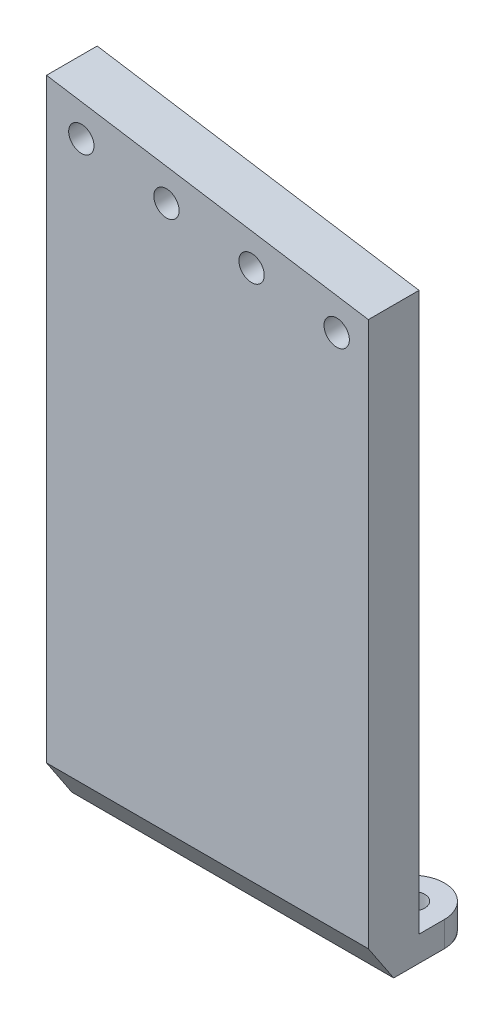
ISO-10303-21;
HEADER;
FILE_DESCRIPTION(('STEP AP214'),'2;1');
FILE_NAME('part.step','',(''),(''),'','','');
FILE_SCHEMA(('AUTOMOTIVE_DESIGN { 1 0 10303 214 1 1 1 1 }'));
ENDSEC;
DATA;
#1=APPLICATION_CONTEXT('core data for automotive mechanical design processes');
#2=APPLICATION_PROTOCOL_DEFINITION('international standard','automotive_design',2000,#1);
#3=PRODUCT_CONTEXT('',#1,'mechanical');
#4=PRODUCT('Part','Part','',(#3));
#5=PRODUCT_RELATED_PRODUCT_CATEGORY('part','',(#4));
#6=PRODUCT_DEFINITION_FORMATION('','',#4);
#7=PRODUCT_DEFINITION_CONTEXT('part definition',#1,'design');
#8=PRODUCT_DEFINITION('design','',#6,#7);
#9=PRODUCT_DEFINITION_SHAPE('','',#8);
#10=(LENGTH_UNIT() NAMED_UNIT(*) SI_UNIT(.MILLI.,.METRE.));
#11=(NAMED_UNIT(*) PLANE_ANGLE_UNIT() SI_UNIT($,.RADIAN.));
#12=(NAMED_UNIT(*) SI_UNIT($,.STERADIAN.) SOLID_ANGLE_UNIT());
#13=UNCERTAINTY_MEASURE_WITH_UNIT(LENGTH_MEASURE(1.E-05),#10,'distance_accuracy_value','');
#14=(GEOMETRIC_REPRESENTATION_CONTEXT(3) GLOBAL_UNCERTAINTY_ASSIGNED_CONTEXT((#13)) GLOBAL_UNIT_ASSIGNED_CONTEXT((#10,
#11,#12)) REPRESENTATION_CONTEXT('',''));
#15=CARTESIAN_POINT('',(0.,0.,0.));
#16=DIRECTION('',(0.,0.,1.));
#17=DIRECTION('',(1.,0.,0.));
#18=AXIS2_PLACEMENT_3D('',#15,#16,#17);
#19=CARTESIAN_POINT('',(3.175,2.54,-7.62));
#20=DIRECTION('',(0.,-1.,0.));
#21=DIRECTION('',(0.,0.,-1.));
#22=AXIS2_PLACEMENT_3D('',#19,#20,#21);
#23=PLANE('',#22);
#24=CARTESIAN_POINT('',(35.433,2.54,-7.62));
#25=DIRECTION('',(0.,-1.,0.));
#26=DIRECTION('',(0.,0.,1.));
#27=AXIS2_PLACEMENT_3D('',#24,#25,#26);
#28=CIRCLE('',#27,3.175);
#29=CARTESIAN_POINT('',(32.258,2.54,-7.62));
#30=VERTEX_POINT('',#29);
#31=CARTESIAN_POINT('',(38.608,2.54,-7.62));
#32=VERTEX_POINT('',#31);
#33=EDGE_CURVE('E185',#30,#32,#28,.T.);
#34=ORIENTED_EDGE('',*,*,#33,.F.);
#35=DIRECTION('',(0.,0.,1.));
#36=VECTOR('',#35,1.);
#37=CARTESIAN_POINT('',(32.258,2.54,-7.62));
#38=LINE('',#37,#36);
#39=CARTESIAN_POINT('',(32.258,2.54,-5.08));
#40=VERTEX_POINT('',#39);
#41=EDGE_CURVE('E152',#30,#40,#38,.T.);
#42=ORIENTED_EDGE('',*,*,#41,.T.);
#43=DIRECTION('',(-1.,0.,0.));
#44=VECTOR('',#43,1.);
#45=CARTESIAN_POINT('',(0.,2.54,-5.08));
#46=LINE('',#45,#44);
#47=CARTESIAN_POINT('',(64.516,2.54,-5.08));
#48=VERTEX_POINT('',#47);
#49=EDGE_CURVE('E11',#48,#40,#46,.T.);
#50=ORIENTED_EDGE('',*,*,#49,.F.);
#51=DIRECTION('',(0.,0.,1.));
#52=VECTOR('',#51,1.);
#53=CARTESIAN_POINT('',(64.516,2.54,0.));
#54=LINE('',#53,#52);
#55=CARTESIAN_POINT('',(64.516,2.54,-7.62));
#56=VERTEX_POINT('',#55);
#57=EDGE_CURVE('E188',#56,#48,#54,.T.);
#58=ORIENTED_EDGE('',*,*,#57,.F.);
#59=CARTESIAN_POINT('',(61.341,2.54,-7.62));
#60=DIRECTION('',(0.,-1.,0.));
#61=DIRECTION('',(0.,0.,-1.));
#62=AXIS2_PLACEMENT_3D('',#59,#60,#61);
#63=CIRCLE('',#62,3.175);
#64=CARTESIAN_POINT('',(58.166,2.54,-7.62));
#65=VERTEX_POINT('',#64);
#66=EDGE_CURVE('E372',#65,#56,#63,.T.);
#67=ORIENTED_EDGE('',*,*,#66,.F.);
#68=DIRECTION('',(1.,0.,0.));
#69=VECTOR('',#68,1.);
#70=CARTESIAN_POINT('',(58.166,2.54,-7.62));
#71=LINE('',#70,#69);
#72=EDGE_CURVE('E374',#32,#65,#71,.T.);
#73=ORIENTED_EDGE('',*,*,#72,.F.);
#74=EDGE_LOOP('',(#34,#42,#50,#58,#67,#73));
#75=FACE_BOUND('',#74,.T.);
#76=CARTESIAN_POINT('',(35.433,2.54,-7.62));
#77=DIRECTION('',(0.,-1.,0.));
#78=DIRECTION('',(0.,0.,1.));
#79=AXIS2_PLACEMENT_3D('',#76,#77,#78);
#80=CIRCLE('',#79,1.2065);
#81=CARTESIAN_POINT('',(35.433,2.54,-6.4135));
#82=VERTEX_POINT('',#81);
#83=EDGE_CURVE('E176',#82,#82,#80,.T.);
#84=ORIENTED_EDGE('',*,*,#83,.T.);
#85=EDGE_LOOP('',(#84));
#86=FACE_BOUND('',#85,.T.);
#87=CARTESIAN_POINT('',(61.341,2.54,-7.62));
#88=DIRECTION('',(0.,-1.,0.));
#89=DIRECTION('',(0.,0.,1.));
#90=AXIS2_PLACEMENT_3D('',#87,#88,#89);
#91=CIRCLE('',#90,1.2065);
#92=CARTESIAN_POINT('',(61.341,2.54,-6.4135));
#93=VERTEX_POINT('',#92);
#94=EDGE_CURVE('E179',#93,#93,#91,.T.);
#95=ORIENTED_EDGE('',*,*,#94,.T.);
#96=EDGE_LOOP('',(#95));
#97=FACE_BOUND('',#96,.T.);
#98=ADVANCED_FACE('F33',(#75,#86,#97),#23,.F.);
#99=CARTESIAN_POINT('',(3.175,0.,-7.62));
#100=DIRECTION('',(0.,-1.,0.));
#101=DIRECTION('',(0.,0.,-1.));
#102=AXIS2_PLACEMENT_3D('',#99,#100,#101);
#103=PLANE('',#102);
#104=DIRECTION('',(0.,0.,1.));
#105=VECTOR('',#104,1.);
#106=CARTESIAN_POINT('',(32.258,0.,-7.62));
#107=LINE('',#106,#105);
#108=CARTESIAN_POINT('',(32.258,0.,-6.6275294111197));
#109=VERTEX_POINT('',#108);
#110=CARTESIAN_POINT('',(32.258,0.,-2.54));
#111=VERTEX_POINT('',#110);
#112=EDGE_CURVE('E255',#109,#111,#107,.T.);
#113=ORIENTED_EDGE('',*,*,#112,.F.);
#114=CARTESIAN_POINT('',(35.3490541248744,0.,-7.64786729186757));
#115=DIRECTION('',(0.,1.,0.));
#116=DIRECTION('',(1.,0.,0.));
#117=AXIS2_PLACEMENT_3D('',#114,#115,#116);
#118=ELLIPSE('',#117,3.25906797448663,3.21939192033137);
#119=CARTESIAN_POINT('',(38.608,0.,-7.62));
#120=VERTEX_POINT('',#119);
#121=EDGE_CURVE('E257',#109,#120,#118,.T.);
#122=ORIENTED_EDGE('',*,*,#121,.T.);
#123=DIRECTION('',(1.,0.,0.));
#124=VECTOR('',#123,1.);
#125=CARTESIAN_POINT('',(58.166,0.,-7.62));
#126=LINE('',#125,#124);
#127=CARTESIAN_POINT('',(58.0046427910713,0.,-7.62));
#128=VERTEX_POINT('',#127);
#129=EDGE_CURVE('E362',#120,#128,#126,.T.);
#130=ORIENTED_EDGE('',*,*,#129,.T.);
#131=CARTESIAN_POINT('',(61.2603213955356,0.,-7.61591866559716));
#132=DIRECTION('',(0.,1.,0.));
#133=DIRECTION('',(1.,0.,0.));
#134=AXIS2_PLACEMENT_3D('',#131,#132,#133);
#135=ELLIPSE('',#134,3.25568122609679,3.21604640238336);
#136=CARTESIAN_POINT('',(64.516,0.,-7.61183733119424));
#137=VERTEX_POINT('',#136);
#138=EDGE_CURVE('E339',#128,#137,#135,.T.);
#139=ORIENTED_EDGE('',*,*,#138,.T.);
#140=DIRECTION('',(0.,0.,1.));
#141=VECTOR('',#140,1.);
#142=CARTESIAN_POINT('',(64.516,0.,0.));
#143=LINE('',#142,#141);
#144=CARTESIAN_POINT('',(64.516,0.,-2.54));
#145=VERTEX_POINT('',#144);
#146=EDGE_CURVE('E182',#137,#145,#143,.T.);
#147=ORIENTED_EDGE('',*,*,#146,.T.);
#148=DIRECTION('',(-1.,0.,0.));
#149=VECTOR('',#148,1.);
#150=CARTESIAN_POINT('',(36.8370501198393,0.,-2.54));
#151=LINE('',#150,#149);
#152=EDGE_CURVE('E41',#145,#111,#151,.T.);
#153=ORIENTED_EDGE('',*,*,#152,.T.);
#154=EDGE_LOOP('',(#113,#122,#130,#139,#147,#153));
#155=FACE_BOUND('',#154,.T.);
#156=ADVANCED_FACE('F246',(#155),#103,.T.);
#157=CARTESIAN_POINT('',(0.,2.54,0.));
#158=DIRECTION('',(0.,0.,-1.));
#159=DIRECTION('',(-1.,0.,0.));
#160=AXIS2_PLACEMENT_3D('',#157,#158,#159);
#161=PLANE('',#160);
#162=DIRECTION('',(-0.987825950711718,0.155563141844365,0.));
#163=VECTOR('',#162,1.);
#164=CARTESIAN_POINT('',(32.258,63.5,0.));
#165=LINE('',#164,#163);
#166=CARTESIAN_POINT('',(64.516,58.42,0.));
#167=VERTEX_POINT('',#166);
#168=CARTESIAN_POINT('',(32.258,63.5,0.));
#169=VERTEX_POINT('',#168);
#170=EDGE_CURVE('E158',#167,#169,#165,.T.);
#171=ORIENTED_EDGE('',*,*,#170,.T.);
#172=DIRECTION('',(0.,-1.,0.));
#173=VECTOR('',#172,1.);
#174=CARTESIAN_POINT('',(32.258,63.5,0.));
#175=LINE('',#174,#173);
#176=CARTESIAN_POINT('',(32.258,3.81,0.));
#177=VERTEX_POINT('',#176);
#178=EDGE_CURVE('E142',#169,#177,#175,.T.);
#179=ORIENTED_EDGE('',*,*,#178,.T.);
#180=DIRECTION('',(-1.,0.,0.));
#181=VECTOR('',#180,1.);
#182=CARTESIAN_POINT('',(36.8370501198393,3.81,0.));
#183=LINE('',#182,#181);
#184=CARTESIAN_POINT('',(64.516,3.81,0.));
#185=VERTEX_POINT('',#184);
#186=EDGE_CURVE('E211',#185,#177,#183,.T.);
#187=ORIENTED_EDGE('',*,*,#186,.F.);
#188=DIRECTION('',(0.,-1.,0.));
#189=VECTOR('',#188,1.);
#190=CARTESIAN_POINT('',(64.516,2.54,0.));
#191=LINE('',#190,#189);
#192=EDGE_CURVE('E165',#167,#185,#191,.T.);
#193=ORIENTED_EDGE('',*,*,#192,.F.);
#194=EDGE_LOOP('',(#171,#179,#187,#193));
#195=FACE_BOUND('',#194,.T.);
#196=CARTESIAN_POINT('',(61.341,55.7058710355681,0.));
#197=DIRECTION('',(0.,0.,1.));
#198=DIRECTION('',(1.,0.,0.));
#199=AXIS2_PLACEMENT_3D('',#196,#197,#198);
#200=CIRCLE('',#199,1.27);
#201=CARTESIAN_POINT('',(62.611,55.7058710355681,0.));
#202=VERTEX_POINT('',#201);
#203=EDGE_CURVE('E273',#202,#202,#200,.F.);
#204=ORIENTED_EDGE('',*,*,#203,.T.);
#205=EDGE_LOOP('',(#204));
#206=FACE_BOUND('',#205,.T.);
#207=CARTESIAN_POINT('',(52.8101350896536,57.049314328536,0.));
#208=DIRECTION('',(0.,0.,1.));
#209=DIRECTION('',(1.,0.,0.));
#210=AXIS2_PLACEMENT_3D('',#207,#208,#209);
#211=CIRCLE('',#210,1.27);
#212=CARTESIAN_POINT('',(54.0801350896536,57.049314328536,0.));
#213=VERTEX_POINT('',#212);
#214=EDGE_CURVE('E279',#213,#213,#211,.F.);
#215=ORIENTED_EDGE('',*,*,#214,.T.);
#216=EDGE_LOOP('',(#215));
#217=FACE_BOUND('',#216,.T.);
#218=CARTESIAN_POINT('',(44.2792701793072,58.392757621504,0.));
#219=DIRECTION('',(0.,0.,1.));
#220=DIRECTION('',(1.,0.,0.));
#221=AXIS2_PLACEMENT_3D('',#218,#219,#220);
#222=CIRCLE('',#221,1.27);
#223=CARTESIAN_POINT('',(45.5492701793072,58.392757621504,0.));
#224=VERTEX_POINT('',#223);
#225=EDGE_CURVE('E285',#224,#224,#222,.F.);
#226=ORIENTED_EDGE('',*,*,#225,.T.);
#227=EDGE_LOOP('',(#226));
#228=FACE_BOUND('',#227,.T.);
#229=CARTESIAN_POINT('',(35.7484052689608,59.7362009144719,0.));
#230=DIRECTION('',(0.,0.,1.));
#231=DIRECTION('',(1.,0.,0.));
#232=AXIS2_PLACEMENT_3D('',#229,#230,#231);
#233=CIRCLE('',#232,1.27);
#234=CARTESIAN_POINT('',(37.0184052689608,59.7362009144719,0.));
#235=VERTEX_POINT('',#234);
#236=EDGE_CURVE('E168',#235,#235,#233,.F.);
#237=ORIENTED_EDGE('',*,*,#236,.T.);
#238=EDGE_LOOP('',(#237));
#239=FACE_BOUND('',#238,.T.);
#240=ADVANCED_FACE('F35',(#195,#206,#217,#228,#239),#161,.F.);
#241=CARTESIAN_POINT('',(0.,63.5,-5.08));
#242=DIRECTION('',(0.,0.,1.));
#243=DIRECTION('',(1.,0.,0.));
#244=AXIS2_PLACEMENT_3D('',#241,#242,#243);
#245=PLANE('',#244);
#246=ORIENTED_EDGE('',*,*,#49,.T.);
#247=DIRECTION('',(0.,1.,0.));
#248=VECTOR('',#247,1.);
#249=CARTESIAN_POINT('',(32.258,63.5,-5.08));
#250=LINE('',#249,#248);
#251=CARTESIAN_POINT('',(32.258,63.5,-5.08));
#252=VERTEX_POINT('',#251);
#253=EDGE_CURVE('E379',#40,#252,#250,.T.);
#254=ORIENTED_EDGE('',*,*,#253,.T.);
#255=DIRECTION('',(0.987825950711718,-0.155563141844365,0.));
#256=VECTOR('',#255,1.);
#257=CARTESIAN_POINT('',(32.258,63.5,-5.08));
#258=LINE('',#257,#256);
#259=CARTESIAN_POINT('',(64.516,58.42,-5.08));
#260=VERTEX_POINT('',#259);
#261=EDGE_CURVE('E160',#252,#260,#258,.T.);
#262=ORIENTED_EDGE('',*,*,#261,.T.);
#263=DIRECTION('',(0.,-1.,0.));
#264=VECTOR('',#263,1.);
#265=CARTESIAN_POINT('',(64.516,63.5,-5.08));
#266=LINE('',#265,#264);
#267=EDGE_CURVE('E161',#260,#48,#266,.T.);
#268=ORIENTED_EDGE('',*,*,#267,.T.);
#269=EDGE_LOOP('',(#246,#254,#262,#268));
#270=FACE_BOUND('',#269,.T.);
#271=CARTESIAN_POINT('',(61.341,55.7058710355681,-5.08));
#272=DIRECTION('',(0.,0.,1.));
#273=DIRECTION('',(1.,0.,0.));
#274=AXIS2_PLACEMENT_3D('',#271,#272,#273);
#275=CIRCLE('',#274,1.27);
#276=CARTESIAN_POINT('',(62.611,55.7058710355681,-5.08));
#277=VERTEX_POINT('',#276);
#278=EDGE_CURVE('E265',#277,#277,#275,.T.);
#279=ORIENTED_EDGE('',*,*,#278,.T.);
#280=EDGE_LOOP('',(#279));
#281=FACE_BOUND('',#280,.T.);
#282=CARTESIAN_POINT('',(52.8101350896536,57.049314328536,-5.08));
#283=DIRECTION('',(0.,0.,1.));
#284=DIRECTION('',(1.,0.,0.));
#285=AXIS2_PLACEMENT_3D('',#282,#283,#284);
#286=CIRCLE('',#285,1.27);
#287=CARTESIAN_POINT('',(54.0801350896536,57.049314328536,-5.08));
#288=VERTEX_POINT('',#287);
#289=EDGE_CURVE('E276',#288,#288,#286,.T.);
#290=ORIENTED_EDGE('',*,*,#289,.T.);
#291=EDGE_LOOP('',(#290));
#292=FACE_BOUND('',#291,.T.);
#293=CARTESIAN_POINT('',(44.2792701793072,58.392757621504,-5.08));
#294=DIRECTION('',(0.,0.,1.));
#295=DIRECTION('',(1.,0.,0.));
#296=AXIS2_PLACEMENT_3D('',#293,#294,#295);
#297=CIRCLE('',#296,1.27);
#298=CARTESIAN_POINT('',(45.5492701793072,58.392757621504,-5.08));
#299=VERTEX_POINT('',#298);
#300=EDGE_CURVE('E282',#299,#299,#297,.T.);
#301=ORIENTED_EDGE('',*,*,#300,.T.);
#302=EDGE_LOOP('',(#301));
#303=FACE_BOUND('',#302,.T.);
#304=CARTESIAN_POINT('',(35.7484052689608,59.7362009144719,-5.08));
#305=DIRECTION('',(0.,0.,1.));
#306=DIRECTION('',(1.,0.,0.));
#307=AXIS2_PLACEMENT_3D('',#304,#305,#306);
#308=CIRCLE('',#307,1.27);
#309=CARTESIAN_POINT('',(37.0184052689608,59.7362009144719,-5.08));
#310=VERTEX_POINT('',#309);
#311=EDGE_CURVE('E172',#310,#310,#308,.T.);
#312=ORIENTED_EDGE('',*,*,#311,.T.);
#313=EDGE_LOOP('',(#312));
#314=FACE_BOUND('',#313,.T.);
#315=ADVANCED_FACE('F240',(#270,#281,#292,#303,#314),#245,.F.);
#316=CARTESIAN_POINT('',(36.8370501198393,0.,-2.54));
#317=DIRECTION('',(0.,0.554700196225229,-0.832050294337844));
#318=DIRECTION('',(0.,0.832050294337844,0.554700196225229));
#319=AXIS2_PLACEMENT_3D('',#316,#317,#318);
#320=PLANE('',#319);
#321=ORIENTED_EDGE('',*,*,#186,.T.);
#322=DIRECTION('',(0.,-0.832050294337844,-0.554700196225229));
#323=VECTOR('',#322,1.);
#324=CARTESIAN_POINT('',(32.258,0.,-2.54));
#325=LINE('',#324,#323);
#326=EDGE_CURVE('E148',#177,#111,#325,.T.);
#327=ORIENTED_EDGE('',*,*,#326,.T.);
#328=ORIENTED_EDGE('',*,*,#152,.F.);
#329=DIRECTION('',(0.,-0.832050294337844,-0.554700196225229));
#330=VECTOR('',#329,1.);
#331=CARTESIAN_POINT('',(64.516,0.,-2.54));
#332=LINE('',#331,#330);
#333=EDGE_CURVE('E262',#185,#145,#332,.T.);
#334=ORIENTED_EDGE('',*,*,#333,.F.);
#335=EDGE_LOOP('',(#321,#327,#328,#334));
#336=FACE_BOUND('',#335,.T.);
#337=ADVANCED_FACE('F237',(#336),#320,.F.);
#338=CARTESIAN_POINT('',(61.341,0.,-7.62));
#339=DIRECTION('',(0.,-1.,0.));
#340=DIRECTION('',(0.,0.,-1.));
#341=AXIS2_PLACEMENT_3D('',#338,#339,#340);
#342=PLANE('',#341);
#343=CARTESIAN_POINT('',(64.5159999999775,3.54360638055162E-12,-7.62000003545597));
#344=VERTEX_POINT('',#343);
#345=CARTESIAN_POINT('',(63.7576621756475,0.,-9.67921280863444));
#346=VERTEX_POINT('',#345);
#347=EDGE_CURVE('E348',#344,#346,#135,.T.);
#348=ORIENTED_EDGE('',*,*,#347,.T.);
#349=CARTESIAN_POINT('',(61.341,0.,-7.62));
#350=DIRECTION('',(0.,-1.,0.));
#351=DIRECTION('',(0.,0.,-1.));
#352=AXIS2_PLACEMENT_3D('',#349,#350,#351);
#353=CIRCLE('',#352,3.175);
#354=EDGE_CURVE('E363',#346,#344,#353,.T.);
#355=ORIENTED_EDGE('',*,*,#354,.T.);
#356=EDGE_LOOP('',(#348,#355));
#357=FACE_BOUND('',#356,.T.);
#358=ADVANCED_FACE('F225',(#357),#342,.T.);
#359=CARTESIAN_POINT('',(64.516,2.54,0.));
#360=DIRECTION('',(-1.,0.,0.));
#361=DIRECTION('',(0.,0.,-1.));
#362=AXIS2_PLACEMENT_3D('',#359,#360,#361);
#363=PLANE('',#362);
#364=CARTESIAN_POINT('',(64.516,0.,-7.61591866559716));
#365=VERTEX_POINT('',#364);
#366=EDGE_CURVE('E364',#344,#365,#143,.T.);
#367=ORIENTED_EDGE('',*,*,#366,.F.);
#368=DIRECTION('',(0.,-1.,0.));
#369=VECTOR('',#368,1.);
#370=CARTESIAN_POINT('',(64.516,2.54,-7.62));
#371=LINE('',#370,#369);
#372=EDGE_CURVE('E57',#56,#344,#371,.T.);
#373=ORIENTED_EDGE('',*,*,#372,.F.);
#374=ORIENTED_EDGE('',*,*,#57,.T.);
#375=ORIENTED_EDGE('',*,*,#267,.F.);
#376=DIRECTION('',(0.,0.,1.));
#377=VECTOR('',#376,1.);
#378=CARTESIAN_POINT('',(64.516,58.42,-37.735550278628));
#379=LINE('',#378,#377);
#380=EDGE_CURVE('E167',#260,#167,#379,.T.);
#381=ORIENTED_EDGE('',*,*,#380,.T.);
#382=ORIENTED_EDGE('',*,*,#192,.T.);
#383=ORIENTED_EDGE('',*,*,#333,.T.);
#384=ORIENTED_EDGE('',*,*,#146,.F.);
#385=CARTESIAN_POINT('',(61.3391084632219,0.500297879807579,-7.61591866559716));
#386=DIRECTION('',(-0.155563141844365,-0.987825950711718,0.));
#387=DIRECTION('',(0.987825950711718,-0.155563141844365,0.));
#388=AXIS2_PLACEMENT_3D('',#385,#386,#387);
#389=CIRCLE('',#388,3.21604640238336);
#390=EDGE_CURVE('E204',#365,#137,#389,.T.);
#391=ORIENTED_EDGE('',*,*,#390,.F.);
#392=EDGE_LOOP('',(#367,#373,#374,#375,#381,#382,#383,#384,#391));
#393=FACE_BOUND('',#392,.T.);
#394=ADVANCED_FACE('F233',(#393),#363,.F.);
#395=CARTESIAN_POINT('',(35.433,2.54,-7.62));
#396=DIRECTION('',(0.,-1.,0.));
#397=DIRECTION('',(0.,0.,-1.));
#398=AXIS2_PLACEMENT_3D('',#395,#396,#397);
#399=CYLINDRICAL_SURFACE('',#398,3.175);
#400=DIRECTION('',(0.,-1.,0.));
#401=VECTOR('',#400,1.);
#402=CARTESIAN_POINT('',(32.258,2.54,-7.62));
#403=LINE('',#402,#401);
#404=CARTESIAN_POINT('',(32.258,0.999999999999999,-7.62));
#405=VERTEX_POINT('',#404);
#406=EDGE_CURVE('E356',#30,#405,#403,.T.);
#407=ORIENTED_EDGE('',*,*,#406,.F.);
#408=ORIENTED_EDGE('',*,*,#33,.T.);
#409=DIRECTION('',(0.,-1.,0.));
#410=VECTOR('',#409,1.);
#411=CARTESIAN_POINT('',(38.608,2.54,-7.62));
#412=LINE('',#411,#410);
#413=EDGE_CURVE('E359',#32,#120,#412,.T.);
#414=ORIENTED_EDGE('',*,*,#413,.T.);
#415=CARTESIAN_POINT('',(35.433,0.499999999999999,-7.62));
#416=DIRECTION('',(-0.155563141844365,-0.987825950711718,0.));
#417=DIRECTION('',(0.987825950711718,-0.155563141844365,0.));
#418=AXIS2_PLACEMENT_3D('',#415,#416,#417);
#419=ELLIPSE('',#418,3.21412896443189,3.175);
#420=EDGE_CURVE('E199',#405,#120,#419,.T.);
#421=ORIENTED_EDGE('',*,*,#420,.F.);
#422=EDGE_LOOP('',(#407,#408,#414,#421));
#423=FACE_BOUND('',#422,.T.);
#424=ADVANCED_FACE('F229',(#423),#399,.T.);
#425=CARTESIAN_POINT('',(58.166,2.54,-7.62));
#426=DIRECTION('',(0.,0.,1.));
#427=DIRECTION('',(-1.,0.,0.));
#428=AXIS2_PLACEMENT_3D('',#425,#426,#427);
#429=PLANE('',#428);
#430=ORIENTED_EDGE('',*,*,#129,.F.);
#431=ORIENTED_EDGE('',*,*,#413,.F.);
#432=ORIENTED_EDGE('',*,*,#72,.T.);
#433=DIRECTION('',(0.,-1.,0.));
#434=VECTOR('',#433,1.);
#435=CARTESIAN_POINT('',(58.166,2.54,-7.62));
#436=LINE('',#435,#434);
#437=CARTESIAN_POINT('',(58.166,1.,-7.62));
#438=VERTEX_POINT('',#437);
#439=EDGE_CURVE('E343',#65,#438,#436,.T.);
#440=ORIENTED_EDGE('',*,*,#439,.T.);
#441=DIRECTION('',(0.987825950711718,-0.155563141844365,0.));
#442=VECTOR('',#441,1.);
#443=CARTESIAN_POINT('',(57.9293492649283,1.03726783229475,-7.62));
#444=LINE('',#443,#442);
#445=CARTESIAN_POINT('',(58.1622169264438,1.00059575961516,-7.62));
#446=VERTEX_POINT('',#445);
#447=EDGE_CURVE('E330',#446,#438,#444,.T.);
#448=ORIENTED_EDGE('',*,*,#447,.F.);
#449=DIRECTION('',(0.155563141844365,0.987825950711718,0.));
#450=VECTOR('',#449,1.);
#451=CARTESIAN_POINT('',(57.7670865461591,-1.50848215519261,-7.62));
#452=LINE('',#451,#450);
#453=EDGE_CURVE('E337',#128,#446,#452,.T.);
#454=ORIENTED_EDGE('',*,*,#453,.F.);
#455=EDGE_LOOP('',(#430,#431,#432,#440,#448,#454));
#456=FACE_BOUND('',#455,.T.);
#457=ADVANCED_FACE('F223',(#456),#429,.F.);
#458=CARTESIAN_POINT('',(61.341,2.54,-7.62));
#459=DIRECTION('',(0.,-1.,0.));
#460=DIRECTION('',(0.,0.,-1.));
#461=AXIS2_PLACEMENT_3D('',#458,#459,#460);
#462=CYLINDRICAL_SURFACE('',#461,3.175);
#463=CARTESIAN_POINT('',(61.341,0.5,-7.62));
#464=DIRECTION('',(-0.155563141844365,-0.987825950711718,0.));
#465=DIRECTION('',(0.987825950711718,-0.155563141844365,0.));
#466=AXIS2_PLACEMENT_3D('',#463,#464,#465);
#467=ELLIPSE('',#466,3.21412896443189,3.175);
#468=CARTESIAN_POINT('',(64.4997099237366,0.00256536634069405,-7.94121117282106));
#469=VERTEX_POINT('',#468);
#470=EDGE_CURVE('E203',#438,#469,#467,.T.);
#471=ORIENTED_EDGE('',*,*,#470,.F.);
#472=ORIENTED_EDGE('',*,*,#439,.F.);
#473=ORIENTED_EDGE('',*,*,#66,.T.);
#474=ORIENTED_EDGE('',*,*,#372,.T.);
#475=ORIENTED_EDGE('',*,*,#354,.F.);
#476=CARTESIAN_POINT('',(63.7569164384787,0.,-9.68009047429674));
#477=VERTEX_POINT('',#476);
#478=EDGE_CURVE('E191',#477,#346,#353,.T.);
#479=ORIENTED_EDGE('',*,*,#478,.F.);
#480=CARTESIAN_POINT('',(63.7576359041481,2.89927095979127E-05,-9.67924644148829));
#481=CARTESIAN_POINT('',(63.6643379140934,-0.00372406969738914,-9.78873746370257));
#482=CARTESIAN_POINT('',(63.5636099825219,-0.00913251030897061,-9.89184688291844));
#483=CARTESIAN_POINT('',(63.3492673845817,-0.0259617995329465,-10.0833592044665));
#484=CARTESIAN_POINT('',(63.2356436890762,-0.0373868814029586,-10.1717516943864));
#485=CARTESIAN_POINT('',(63.0241824526848,-0.0678965925123294,-10.3144498619984));
#486=CARTESIAN_POINT('',(62.9282420285499,-0.0847915562185619,-10.371993547465));
#487=CARTESIAN_POINT('',(62.781952599066,-0.119030412548095,-10.4497239724649));
#488=CARTESIAN_POINT('',(62.7328268070274,-0.131914458112013,-10.4741896966866));
#489=CARTESIAN_POINT('',(62.6343606922785,-0.161538636388512,-10.520136336627));
#490=CARTESIAN_POINT('',(62.585020515412,-0.178276458738004,-10.5416190283714));
#491=CARTESIAN_POINT('',(62.4725853514831,-0.222232080409761,-10.5872880240732));
#492=CARTESIAN_POINT('',(62.4096769023044,-0.251082710777737,-10.6104346964456));
#493=CARTESIAN_POINT('',(62.2877513613646,-0.318876641761765,-10.6512385718857));
#494=CARTESIAN_POINT('',(62.228723185926,-0.357789475455506,-10.6689119981672));
#495=CARTESIAN_POINT('',(62.1173078343197,-0.446382375983791,-10.6991791481844));
#496=CARTESIAN_POINT('',(62.0649571881017,-0.49611795209535,-10.7117456889912));
#497=CARTESIAN_POINT('',(61.9689928478368,-0.60419631122843,-10.7326665481305));
#498=CARTESIAN_POINT('',(61.9253955429336,-0.662554891323601,-10.7410130086151));
#499=CARTESIAN_POINT('',(61.8547615879713,-0.771927318194825,-10.7533155952061));
#500=CARTESIAN_POINT('',(61.8261696838245,-0.821911495463154,-10.757825532643));
#501=CARTESIAN_POINT('',(61.7732757345274,-0.924219946654826,-10.7655488729967));
#502=CARTESIAN_POINT('',(61.7489771944865,-0.976546089286314,-10.7687612192843));
#503=CARTESIAN_POINT('',(61.7037388923583,-1.08296618198036,-10.7742933352141));
#504=CARTESIAN_POINT('',(61.6828169929202,-1.13706782132741,-10.7766084432829));
#505=CARTESIAN_POINT('',(61.6437537956007,-1.24624913511607,-10.7805925589771));
#506=CARTESIAN_POINT('',(61.6256113305724,-1.3013283881337,-10.782261838252));
#507=CARTESIAN_POINT('',(61.5684920928349,-1.48670876381068,-10.787100064996));
#508=CARTESIAN_POINT('',(61.5343288935785,-1.618503013938,-10.7892646361707));
#509=CARTESIAN_POINT('',(61.4728200539605,-1.88371237364424,-10.7924053393302));
#510=CARTESIAN_POINT('',(61.4454813150341,-2.01712898208005,-10.7933802721002));
#511=CARTESIAN_POINT('',(61.3950483823994,-2.28513382373777,-10.7946405489373));
#512=CARTESIAN_POINT('',(61.3719659282189,-2.41972425590769,-10.7949240113595));
#513=CARTESIAN_POINT('',(61.3286843122967,-2.68929539698824,-10.7950486013621));
#514=CARTESIAN_POINT('',(61.3084838901316,-2.82427590878762,-10.794889922935));
#515=CARTESIAN_POINT('',(61.2506822841772,-3.23046365685446,-10.7939532272941));
#516=CARTESIAN_POINT('',(61.2160238220583,-3.50208460416694,-10.7927126876083));
#517=CARTESIAN_POINT('',(61.1508936199827,-4.04534185528972,-10.7894654162493));
#518=CARTESIAN_POINT('',(61.120415002311,-4.31697737988086,-10.7874599642742));
#519=CARTESIAN_POINT('',(61.033262208705,-5.12615105468619,-10.7805927359066));
#520=CARTESIAN_POINT('',(60.9801045685293,-5.66405811661804,-10.7748551301668));
#521=CARTESIAN_POINT('',(60.8778043168923,-6.74023826701895,-10.7614432925594));
#522=CARTESIAN_POINT('',(60.8286619015002,-7.27851137206983,-10.7537689661937));
#523=CARTESIAN_POINT('',(60.7325702611375,-8.35561392985555,-10.7365413834557));
#524=CARTESIAN_POINT('',(60.6856226342476,-8.89444350474284,-10.7269867835886));
#525=CARTESIAN_POINT('',(60.5930298033255,-9.97216590283745,-10.7060024477393));
#526=CARTESIAN_POINT('',(60.5473845734713,-10.5110587245778,-10.6945727489643));
#527=CARTESIAN_POINT('',(60.4570328475864,-11.587712747068,-10.6698224618309));
#528=CARTESIAN_POINT('',(60.4123245446328,-12.1254738903452,-10.656505990779));
#529=CARTESIAN_POINT('',(60.3234784843549,-13.2009932265234,-10.6278978144394));
#530=CARTESIAN_POINT('',(60.2793407300531,-13.7387514193936,-10.6126060986927));
#531=CARTESIAN_POINT('',(60.147547551396,-15.3517258357082,-10.563654202985));
#532=CARTESIAN_POINT('',(60.0604907734585,-16.4268996110527,-10.5269114246532));
#533=CARTESIAN_POINT('',(59.8870409047202,-18.5797852660351,-10.4441602935972));
#534=CARTESIAN_POINT('',(59.8006501495873,-19.6574964172529,-10.3981279236451));
#535=CARTESIAN_POINT('',(59.628437678344,-21.8126083849966,-10.2954087638533));
#536=CARTESIAN_POINT('',(59.5426160413039,-22.8900091392992,-10.2387205243722));
#537=CARTESIAN_POINT('',(59.371662582824,-25.0406312093892,-10.1127152244595));
#538=CARTESIAN_POINT('',(59.286529428701,-26.1138547854272,-10.0434395415013));
#539=CARTESIAN_POINT('',(59.1590972168606,-27.7226811570352,-9.92720607629773));
#540=CARTESIAN_POINT('',(59.1166697912591,-28.2587201765412,-9.88641424965334));
#541=CARTESIAN_POINT('',(59.0318993039076,-29.3304120173968,-9.79998926755927));
#542=CARTESIAN_POINT('',(58.9895562413327,-29.866064842489,-9.75435615967914));
#543=CARTESIAN_POINT('',(58.905110201454,-30.9349199121107,-9.65744649840696));
#544=CARTESIAN_POINT('',(58.8630069095263,-31.4681240168414,-9.60619093659847));
#545=CARTESIAN_POINT('',(58.7788721051163,-32.5341393062651,-9.49640928287147));
#546=CARTESIAN_POINT('',(58.7368406555324,-33.0669500235348,-9.43787857521351));
#547=CARTESIAN_POINT('',(58.6524077625903,-34.1377323573487,-9.31058019564987));
#548=CARTESIAN_POINT('',(58.6100077698009,-34.6756911125101,-9.24170039166783));
#549=CARTESIAN_POINT('',(58.546591035254,-35.4806455856864,-9.12789861730729));
#550=CARTESIAN_POINT('',(58.5255025864725,-35.7483800675967,-9.08826024004254));
#551=CARTESIAN_POINT('',(58.4833909447139,-36.283135430878,-9.00452138359104));
#552=CARTESIAN_POINT('',(58.462367746103,-36.5501563735635,-8.96042130133982));
#553=CARTESIAN_POINT('',(58.4202193514566,-37.085614195769,-8.86594886338997));
#554=CARTESIAN_POINT('',(58.3990949603605,-37.3540419442099,-8.8155232346077));
#555=CARTESIAN_POINT('',(58.367460945232,-37.7561185961506,-8.73334937452962));
#556=CARTESIAN_POINT('',(58.3568965721759,-37.8904119485208,-8.70478276851013));
#557=CARTESIAN_POINT('',(58.3358226526429,-38.1583402852732,-8.64496029458419));
#558=CARTESIAN_POINT('',(58.3253130827918,-38.2919755487023,-8.6137056932637));
#559=CARTESIAN_POINT('',(58.3045341948912,-38.5562351906992,-8.54825882083874));
#560=CARTESIAN_POINT('',(58.2942637505207,-38.6868731740613,-8.51412264076129));
#561=CARTESIAN_POINT('',(58.2738086922771,-38.9471102881814,-8.44121692492221));
#562=CARTESIAN_POINT('',(58.263624259966,-39.0767072020308,-8.40243938883665));
#563=CARTESIAN_POINT('',(58.2435126281665,-39.3326981143498,-8.3186294457692));
#564=CARTESIAN_POINT('',(58.233583943747,-39.4591103801435,-8.27365598695889));
#565=CARTESIAN_POINT('',(58.2189683270547,-39.6452801016433,-8.19808337286981));
#566=CARTESIAN_POINT('',(58.2141492016475,-39.7066788716918,-8.17158290566912));
#567=CARTESIAN_POINT('',(58.2046546368454,-39.8276851677336,-8.11477927380279));
#568=CARTESIAN_POINT('',(58.1999790505362,-39.8872945237305,-8.08448017040564));
#569=CARTESIAN_POINT('',(58.1936471729935,-39.9680631438299,-8.03828771299396));
#570=CARTESIAN_POINT('',(58.1918816934115,-39.9905882833034,-8.02482055354106));
#571=CARTESIAN_POINT('',(58.1884051899036,-40.0349563125766,-7.99678791162126));
#572=CARTESIAN_POINT('',(58.1866942099701,-40.0567986509642,-7.9822215723196));
#573=CARTESIAN_POINT('',(58.1816888026272,-40.1207211950961,-7.93674024467663));
#574=CARTESIAN_POINT('',(58.178494060189,-40.1615520675718,-7.90384994035673));
#575=CARTESIAN_POINT('',(58.1745466487138,-40.2120842648953,-7.85319759058481));
#576=CARTESIAN_POINT('',(58.1735208231763,-40.2252253544215,-7.83891491322855));
#577=CARTESIAN_POINT('',(58.1715930433281,-40.2499459729015,-7.80897495184851));
#578=CARTESIAN_POINT('',(58.1706913338884,-40.2615224141415,-7.79331504762047));
#579=CARTESIAN_POINT('',(58.1690569266156,-40.282543346378,-7.76028168892209));
#580=CARTESIAN_POINT('',(58.1683266569434,-40.2919571716835,-7.74288807476331));
#581=CARTESIAN_POINT('',(58.1671320315981,-40.3074202570172,-7.70666719468114));
#582=CARTESIAN_POINT('',(58.1666666518174,-40.3134824722738,-7.68784577340355));
#583=CARTESIAN_POINT('',(58.1661563234365,-40.3202337133474,-7.65451445494531));
#584=CARTESIAN_POINT('',(58.166031841521,-40.3219308581956,-7.64021056238196));
#585=CARTESIAN_POINT('',(58.1659789947909,-40.3228358604141,-7.61152064325131));
#586=CARTESIAN_POINT('',(58.1660506042768,-40.3220440439813,-7.59713462769348));
#587=CARTESIAN_POINT('',(58.1663818411226,-40.3180701244059,-7.56875823117132));
#588=CARTESIAN_POINT('',(58.1666408392206,-40.3148960197954,-7.55476668850429));
#589=CARTESIAN_POINT('',(58.1673203619806,-40.3064919248746,-7.52742516917243));
#590=CARTESIAN_POINT('',(58.1677410249181,-40.301260174524,-7.5140757527607));
#591=CARTESIAN_POINT('',(58.1690090120479,-40.285438355737,-7.48022781138923));
#592=CARTESIAN_POINT('',(58.1699598841067,-40.2735286600187,-7.46035522967183));
#593=CARTESIAN_POINT('',(58.1720840728365,-40.2468691686271,-7.42263304951006));
#594=CARTESIAN_POINT('',(58.1732581060807,-40.232110221522,-7.40479027221175));
#595=CARTESIAN_POINT('',(58.1775937478874,-40.1775526247605,-7.34558071161732));
#596=CARTESIAN_POINT('',(58.1811184574478,-40.1331098072761,-7.30861712784979));
#597=CARTESIAN_POINT('',(58.1885214839509,-40.0396875414159,-7.24101337251747));
#598=CARTESIAN_POINT('',(58.1924020077997,-39.9906797446089,-7.21041713723421));
#599=CARTESIAN_POINT('',(58.2037888111671,-39.8468145521408,-7.12859716534342));
#600=CARTESIAN_POINT('',(58.2115193693991,-39.7490732342085,-7.08251231313483));
#601=CARTESIAN_POINT('',(58.2272361714053,-39.5502970900297,-6.99800581764495));
#602=CARTESIAN_POINT('',(58.2352230867669,-39.4492535978045,-6.95960660162629));
#603=CARTESIAN_POINT('',(58.2513522453905,-39.245168786542,-6.8878370391907));
#604=CARTESIAN_POINT('',(58.2594947701999,-39.1421238393511,-6.85447702356635));
#605=CARTESIAN_POINT('',(58.2758510991186,-38.9351142000852,-6.79142666922391));
#606=CARTESIAN_POINT('',(58.2840647828825,-38.8311510566326,-6.76173108448069));
#607=CARTESIAN_POINT('',(58.3086125003871,-38.5204298905459,-6.677291691232));
#608=CARTESIAN_POINT('',(58.3250289026499,-38.3126164964712,-6.62646686303209));
#609=CARTESIAN_POINT('',(58.3579833142424,-37.8954524864073,-6.53155197634282));
#610=CARTESIAN_POINT('',(58.3745213586725,-37.6861014267439,-6.48746394865897));
#611=CARTESIAN_POINT('',(58.4076978014457,-37.2661499976039,-6.40411401785131));
#612=CARTESIAN_POINT('',(58.4243363071725,-37.0555482979773,-6.36485889412048));
#613=CARTESIAN_POINT('',(58.457665208788,-36.6337220379944,-6.29008451175196));
#614=CARTESIAN_POINT('',(58.4743555978036,-36.4224975603151,-6.25456477831836));
#615=CARTESIAN_POINT('',(58.507749361492,-35.9999275886251,-6.18656106693781));
#616=CARTESIAN_POINT('',(58.5244526680825,-35.7885828839724,-6.1540721247792));
#617=CARTESIAN_POINT('',(58.5578920460708,-35.3655298294331,-6.09153967614773));
#618=CARTESIAN_POINT('',(58.5746281184569,-35.1538214686012,-6.06149624464461));
#619=CARTESIAN_POINT('',(58.6081145256322,-34.7302819952398,-6.00349689955711));
#620=CARTESIAN_POINT('',(58.6248648406463,-34.5184510901062,-5.97553945472034));
#621=CARTESIAN_POINT('',(58.6583880700913,-34.0945673399307,-5.92140358008275));
#622=CARTESIAN_POINT('',(58.6751609842581,-33.8825144974879,-5.89522512968026));
#623=CARTESIAN_POINT('',(58.7254144404101,-33.2472859834279,-5.81915677048549));
#624=CARTESIAN_POINT('',(58.7589249002843,-32.8238361033359,-5.77157181440899));
#625=CARTESIAN_POINT('',(58.8260126091135,-31.9764183567991,-5.68128493728876));
#626=CARTESIAN_POINT('',(58.8595898595192,-31.5524504791832,-5.63858312350412));
#627=CARTESIAN_POINT('',(58.9268068102147,-30.7041028971268,-5.55721509706418));
#628=CARTESIAN_POINT('',(58.9604465148489,-30.2797231650978,-5.51854917674875));
#629=CARTESIAN_POINT('',(59.0277837450144,-29.430668491993,-5.44464995944392));
#630=CARTESIAN_POINT('',(59.0614812709557,-29.0059935488367,-5.40941668690017));
#631=CARTESIAN_POINT('',(59.1626967972569,-27.7311644873095,-5.30812378665187));
#632=CARTESIAN_POINT('',(59.2303015795849,-26.8806627292202,-5.24651377144186));
#633=CARTESIAN_POINT('',(59.3657659065976,-25.1790995060808,-5.13265754211732));
#634=CARTESIAN_POINT('',(59.4336254408466,-24.3280380651108,-5.08041094862086));
#635=CARTESIAN_POINT('',(59.5696755762402,-22.6253591214359,-4.98371484550469));
#636=CARTESIAN_POINT('',(59.6378662303516,-21.7737415499836,-4.93926662859079));
#637=CARTESIAN_POINT('',(59.7746736536635,-20.0702094442048,-4.85710126057886));
#638=CARTESIAN_POINT('',(59.8432904274072,-19.2182949068039,-4.81938418137416));
#639=CARTESIAN_POINT('',(59.9811141365322,-17.5144611548808,-4.74993258598704));
#640=CARTESIAN_POINT('',(60.0503209380484,-16.6625419830546,-4.71819674865508));
#641=CARTESIAN_POINT('',(60.1896450983206,-14.9585984260545,-4.66015074279529));
#642=CARTESIAN_POINT('',(60.2597624519816,-14.1065740414957,-4.63384054392211));
#643=CARTESIAN_POINT('',(60.3736612410898,-12.7373387245627,-4.5956099756776));
#644=CARTESIAN_POINT('',(60.4169638796845,-12.2201317796432,-4.58209782493994));
#645=CARTESIAN_POINT('',(60.5043760541966,-11.1857268384717,-4.55687142961147));
#646=CARTESIAN_POINT('',(60.5484856135831,-10.6685288429194,-4.54515723740734));
#647=CARTESIAN_POINT('',(60.6378940780066,-9.63427349337247,-4.52348797681575));
#648=CARTESIAN_POINT('',(60.6831928103094,-9.117216129854,-4.51353265454844));
#649=CARTESIAN_POINT('',(60.775709034646,-8.08325108627391,-4.49537346851411));
#650=CARTESIAN_POINT('',(60.8229264942429,-7.56634340383052,-4.48716957515307));
#651=CARTESIAN_POINT('',(60.9217280884323,-6.5209299038098,-4.47239361219051));
#652=CARTESIAN_POINT('',(60.9733876174239,-5.99243043486635,-4.46586335850783));
#653=CARTESIAN_POINT('',(61.05611319153,-5.20018116886018,-4.45768723028465));
#654=CARTESIAN_POINT('',(61.084562455828,-4.93616986121099,-4.45523165757526));
#655=CARTESIAN_POINT('',(61.1442086046881,-4.40846480693363,-4.45096352001324));
#656=CARTESIAN_POINT('',(61.1754053568775,-4.14477104562606,-4.44915092420341));
#657=CARTESIAN_POINT('',(61.2444052530027,-3.60030288677887,-4.44626346877766));
#658=CARTESIAN_POINT('',(61.282510562773,-3.31956466111267,-4.44524600481437));
#659=CARTESIAN_POINT('',(61.3468049018957,-2.89949358303597,-4.44493468076776));
#660=CARTESIAN_POINT('',(61.369428869122,-2.75962597509249,-4.4450334690273));
#661=CARTESIAN_POINT('',(61.4182055661571,-2.48053238573215,-4.44584522434213));
#662=CARTESIAN_POINT('',(61.4443576943734,-2.34130629910472,-4.44655808680195));
#663=CARTESIAN_POINT('',(61.5056381244562,-2.04600310542265,-4.449097818989));
#664=CARTESIAN_POINT('',(61.5414889331784,-1.89006718251131,-4.45105644038253));
#665=CARTESIAN_POINT('',(61.6039439993054,-1.65845642477854,-4.45584035862779));
#666=CARTESIAN_POINT('',(61.6262169328974,-1.58161198379058,-4.45774352305843));
#667=CARTESIAN_POINT('',(61.6746928266057,-1.42921699693184,-4.46248981140808));
#668=CARTESIAN_POINT('',(61.700894210832,-1.35366594569956,-4.46533255896349));
#669=CARTESIAN_POINT('',(61.7651519697112,-1.18758294568922,-4.47325298640494));
#670=CARTESIAN_POINT('',(61.8045492011929,-1.09756828861876,-4.47869271764813));
#671=CARTESIAN_POINT('',(61.8945346506193,-0.923675444642388,-4.49329002541223));
#672=CARTESIAN_POINT('',(61.9450870593732,-0.839778739905486,-4.50243578207956));
#673=CARTESIAN_POINT('',(62.0478576581923,-0.699741281563081,-4.52434443251292));
#674=CARTESIAN_POINT('',(62.0974099517587,-0.641500905216725,-4.53591625574748));
#675=CARTESIAN_POINT('',(62.2046918763854,-0.534630921724424,-4.56423275895285));
#676=CARTESIAN_POINT('',(62.2624120204137,-0.485990319145309,-4.58097146382222));
#677=CARTESIAN_POINT('',(62.3833315181311,-0.399568506839141,-4.62030255792913));
#678=CARTESIAN_POINT('',(62.4465144150405,-0.361756065435064,-4.64287774715187));
#679=CARTESIAN_POINT('',(62.575488631034,-0.295646887612725,-4.69399716431536));
#680=CARTESIAN_POINT('',(62.6412860036231,-0.267373869513634,-4.72255598829541));
#681=CARTESIAN_POINT('',(62.7620811846041,-0.222412038029409,-4.7801275892174));
#682=CARTESIAN_POINT('',(62.8170749693868,-0.204582685585276,-4.80829282880136));
#683=CARTESIAN_POINT('',(62.9262139424351,-0.173018832047935,-4.86834396090901));
#684=CARTESIAN_POINT('',(62.9803585824119,-0.159286881193613,-4.90023215350872));
#685=CARTESIAN_POINT('',(63.1407130629838,-0.122699192510206,-5.00129945623437));
#686=CARTESIAN_POINT('',(63.2446835511356,-0.104503750079519,-5.0758059097077));
#687=CARTESIAN_POINT('',(63.4104094795742,-0.0801754541149063,-5.21053058530624));
#688=CARTESIAN_POINT('',(63.474749400672,-0.0720433962327499,-5.26731838441434));
#689=CARTESIAN_POINT('',(63.5987711923297,-0.058101425886361,-5.38606555581442));
#690=CARTESIAN_POINT('',(63.6584517441652,-0.0522921689324762,-5.44802638201523));
#691=CARTESIAN_POINT('',(63.8296484349262,-0.0372901157884763,-5.64092317922493));
#692=CARTESIAN_POINT('',(63.9334858363684,-0.030502756374687,-5.77900864886758));
#693=CARTESIAN_POINT('',(64.1179358580705,-0.02007231163932,-6.07103379983043));
#694=CARTESIAN_POINT('',(64.1984097126448,-0.0164477664819772,-6.22506112215963));
#695=CARTESIAN_POINT('',(64.3332042372109,-0.0107054802859128,-6.54420687349756));
#696=CARTESIAN_POINT('',(64.3875245620043,-0.00858775913546653,-6.70932544886608));
#697=CARTESIAN_POINT('',(64.4696842300205,-0.00487226942682046,-7.05103914802634));
#698=CARTESIAN_POINT('',(64.4967227699456,-0.00329108239103164,-7.22782737291329));
#699=CARTESIAN_POINT('',(64.5207894572648,-0.000271267663991516,-7.58347130970414));
#700=CARTESIAN_POINT('',(64.517811355284,0.00116733027767756,-7.76232744439815));
#701=CARTESIAN_POINT('',(64.4818887494088,0.00394182112461903,-8.11733303401629));
#702=CARTESIAN_POINT('',(64.4488886796712,0.00527751860358084,-8.29347685390438));
#703=CARTESIAN_POINT('',(64.3537785083386,0.00746616086091083,-8.63765685196627));
#704=CARTESIAN_POINT('',(64.2916852433161,0.0083193842232666,-8.80569765749638));
#705=CARTESIAN_POINT('',(64.1558856105864,0.0085730916263691,-9.0955109178922));
#706=CARTESIAN_POINT('',(64.0872198150692,0.00823702550176086,-9.2196754557959));
#707=CARTESIAN_POINT('',(63.9339722699495,0.00581021322516782,-9.45769678151983));
#708=CARTESIAN_POINT('',(63.8493977299267,0.00372026042634387,-9.57155820405832));
#709=CARTESIAN_POINT('',(63.7576359041481,2.89927095979127E-05,-9.67924644148829));
#710=B_SPLINE_CURVE_WITH_KNOTS('',3,(#480,#481,#482,#483,#484,#485,#486,#487,#488,#489,#490,
#491,#492,#493,#494,#495,#496,#497,#498,#499,#500,#501,#502,#503,#504,#505,#506,#507,#508,#509,
#510,#511,#512,#513,#514,#515,#516,#517,#518,#519,#520,#521,#522,#523,#524,#525,#526,#527,#528,
#529,#530,#531,#532,#533,#534,#535,#536,#537,#538,#539,#540,#541,#542,#543,#544,#545,#546,#547,
#548,#549,#550,#551,#552,#553,#554,#555,#556,#557,#558,#559,#560,#561,#562,#563,#564,#565,#566,
#567,#568,#569,#570,#571,#572,#573,#574,#575,#576,#577,#578,#579,#580,#581,#582,#583,#584,#585,
#586,#587,#588,#589,#590,#591,#592,#593,#594,#595,#596,#597,#598,#599,#600,#601,#602,#603,#604,
#605,#606,#607,#608,#609,#610,#611,#612,#613,#614,#615,#616,#617,#618,#619,#620,#621,#622,#623,
#624,#625,#626,#627,#628,#629,#630,#631,#632,#633,#634,#635,#636,#637,#638,#639,#640,#641,#642,
#643,#644,#645,#646,#647,#648,#649,#650,#651,#652,#653,#654,#655,#656,#657,#658,#659,#660,#661,
#662,#663,#664,#665,#666,#667,#668,#669,#670,#671,#672,#673,#674,#675,#676,#677,#678,#679,#680,
#681,#682,#683,#684,#685,#686,#687,#688,#689,#690,#691,#692,#693,#694,#695,#696,#697,#698,#699,
#700,#701,#702,#703,#704,#705,#706,#707,#708,#709),.UNSPECIFIED.,.T.,.F.,(4,2,2,2,2,2,2,2,2,2,2,
2,2,2,2,2,2,2,2,2,2,2,2,2,2,2,2,2,2,2,2,2,2,2,2,2,2,2,2,2,2,2,2,2,2,2,2,2,2,2,2,2,2,2,2,2,2,2,2,
2,2,2,2,2,2,2,2,2,2,2,2,2,2,2,2,2,2,2,2,2,2,2,2,2,2,2,2,2,2,2,2,2,2,2,2,2,2,2,2,2,2,2,2,2,2,2,2,
2,2,2,2,2,2,2,4),(0.,0.431356986279937,0.863017877959702,1.20136618345099,1.37031337626716,
1.53915954670948,1.75726393133161,1.97471550584279,2.19330983132433,2.41230969719404,
2.58533937043249,2.7585096591572,2.93256795898008,3.10655296628668,3.51464447046181,
3.92314701228076,4.33275994660012,4.74219318865407,5.56359259614295,6.38362378777631,
8.0052399950373,9.6269353408903,11.2497936569763,12.8726197748774,14.4919576029093,
16.1113040058337,19.3492208205271,22.5956187076303,25.8424585599132,29.0788123790152,
30.6965768619001,32.3143254503975,33.9262274528036,35.5391574022628,37.1710262910997,
37.985416947909,38.79973521607,39.6214410551433,40.0345316528938,40.4474286573777,
40.8536055679689,41.2604929726297,41.6637468807478,41.8648152094664,42.06567037276,
42.1445453509692,42.223482462053,42.3801436971662,42.4383708079196,42.4967111980384,
42.5558338006703,42.6147262453618,42.6577375312206,42.700743180367,42.7436050803952,
42.7865037230511,42.8556621864345,42.9250465890367,43.097440947562,43.2709880758504,
43.5951293220696,43.9202030719703,44.245934461083,44.5711939833778,45.2146832131607,
45.858366041421,46.5029417544147,47.1474354377563,47.7908542392127,48.4342927579377,
49.0772542059301,49.7202082068321,51.002460198082,52.2847403488142,53.5671133171235,
54.849495417205,57.4156395081335,59.981679601937,62.5481446569187,65.1146371219355,
67.6805620284988,70.2464725835761,71.804046496592,73.361665783662,74.9190600559097,
76.4764280106763,78.0695721043323,78.866213874413,79.6628172836437,80.5126554542079,
80.9376759673382,81.3626241008826,81.8423482722235,82.0823565248008,82.3222687548802,
82.6169485529907,82.9106958165875,83.141652790677,83.372343675083,83.6023623168096,
83.8329487214223,84.0256024175588,84.2183757731882,84.6044692787413,84.8628008183554,
85.1212052095339,85.6373764889092,86.156553580164,86.6757375238085,87.2097528498685,
87.7438793586153,88.2789964654707,88.8138042755705,89.2382508003019,89.6625054342999),.UNSPECIFIED.);
#711=EDGE_CURVE('E205',#469,#477,#710,.T.);
#712=ORIENTED_EDGE('',*,*,#711,.F.);
#713=EDGE_LOOP('',(#471,#472,#473,#474,#475,#479,#712));
#714=FACE_BOUND('',#713,.T.);
#715=ADVANCED_FACE('F217',(#714),#462,.T.);
#716=CARTESIAN_POINT('',(61.341,2.54,-7.62));
#717=DIRECTION('',(0.,-1.,0.));
#718=DIRECTION('',(0.,0.,-1.));
#719=AXIS2_PLACEMENT_3D('',#716,#717,#718);
#720=CYLINDRICAL_SURFACE('',#719,1.2065);
#721=CARTESIAN_POINT('',(61.341,0.5,-7.62));
#722=DIRECTION('',(-0.155563141844365,-0.987825950711718,0.));
#723=DIRECTION('',(0.987825950711718,-0.155563141844365,0.));
#724=AXIS2_PLACEMENT_3D('',#721,#722,#723);
#725=ELLIPSE('',#724,1.22136900648412,1.2065);
#726=CARTESIAN_POINT('',(62.5475,0.31,-7.62));
#727=VERTEX_POINT('',#726);
#728=EDGE_CURVE('E200',#727,#727,#725,.T.);
#729=ORIENTED_EDGE('',*,*,#728,.T.);
#730=EDGE_LOOP('',(#729));
#731=FACE_BOUND('',#730,.T.);
#732=ORIENTED_EDGE('',*,*,#94,.F.);
#733=EDGE_LOOP('',(#732));
#734=FACE_BOUND('',#733,.T.);
#735=ADVANCED_FACE('F222',(#731,#734),#720,.F.);
#736=CARTESIAN_POINT('',(35.433,2.54,-7.62));
#737=DIRECTION('',(0.,-1.,0.));
#738=DIRECTION('',(0.,0.,-1.));
#739=AXIS2_PLACEMENT_3D('',#736,#737,#738);
#740=CYLINDRICAL_SURFACE('',#739,1.2065);
#741=CARTESIAN_POINT('',(35.433,0.499999999999999,-7.62));
#742=DIRECTION('',(-0.155563141844365,-0.987825950711718,0.));
#743=DIRECTION('',(0.987825950711718,-0.155563141844365,0.));
#744=AXIS2_PLACEMENT_3D('',#741,#742,#743);
#745=ELLIPSE('',#744,1.22136900648412,1.2065);
#746=CARTESIAN_POINT('',(36.6395,0.309999999999998,-7.62));
#747=VERTEX_POINT('',#746);
#748=EDGE_CURVE('E196',#747,#747,#745,.T.);
#749=ORIENTED_EDGE('',*,*,#748,.T.);
#750=EDGE_LOOP('',(#749));
#751=FACE_BOUND('',#750,.T.);
#752=ORIENTED_EDGE('',*,*,#83,.F.);
#753=EDGE_LOOP('',(#752));
#754=FACE_BOUND('',#753,.T.);
#755=ADVANCED_FACE('F304',(#751,#754),#740,.F.);
#756=CARTESIAN_POINT('',(32.258,63.5,-37.735550278628));
#757=DIRECTION('',(-0.155563141844365,-0.987825950711718,0.));
#758=DIRECTION('',(-0.987825950711718,0.155563141844365,0.));
#759=AXIS2_PLACEMENT_3D('',#756,#757,#758);
#760=PLANE('',#759);
#761=ORIENTED_EDGE('',*,*,#261,.F.);
#762=DIRECTION('',(0.,0.,-1.));
#763=VECTOR('',#762,1.);
#764=CARTESIAN_POINT('',(32.258,63.5,0.));
#765=LINE('',#764,#763);
#766=EDGE_CURVE('E145',#169,#252,#765,.T.);
#767=ORIENTED_EDGE('',*,*,#766,.F.);
#768=ORIENTED_EDGE('',*,*,#170,.F.);
#769=ORIENTED_EDGE('',*,*,#380,.F.);
#770=EDGE_LOOP('',(#761,#767,#768,#769));
#771=FACE_BOUND('',#770,.T.);
#772=ADVANCED_FACE('F156',(#771),#760,.F.);
#773=CARTESIAN_POINT('',(35.7484052689608,59.7362009144719,3.59210244842766));
#774=DIRECTION('',(0.,0.,-1.));
#775=DIRECTION('',(1.,0.,0.));
#776=AXIS2_PLACEMENT_3D('',#773,#774,#775);
#777=CYLINDRICAL_SURFACE('',#776,1.27);
#778=ORIENTED_EDGE('',*,*,#236,.F.);
#779=EDGE_LOOP('',(#778));
#780=FACE_BOUND('',#779,.T.);
#781=ORIENTED_EDGE('',*,*,#311,.F.);
#782=EDGE_LOOP('',(#781));
#783=FACE_BOUND('',#782,.T.);
#784=ADVANCED_FACE('F292',(#780,#783),#777,.F.);
#785=CARTESIAN_POINT('',(44.2792701793072,58.392757621504,3.59210244842766));
#786=DIRECTION('',(0.,0.,-1.));
#787=DIRECTION('',(1.,0.,0.));
#788=AXIS2_PLACEMENT_3D('',#785,#786,#787);
#789=CYLINDRICAL_SURFACE('',#788,1.27);
#790=ORIENTED_EDGE('',*,*,#225,.F.);
#791=EDGE_LOOP('',(#790));
#792=FACE_BOUND('',#791,.T.);
#793=ORIENTED_EDGE('',*,*,#300,.F.);
#794=EDGE_LOOP('',(#793));
#795=FACE_BOUND('',#794,.T.);
#796=ADVANCED_FACE('F294',(#792,#795),#789,.F.);
#797=CARTESIAN_POINT('',(52.8101350896536,57.049314328536,3.59210244842766));
#798=DIRECTION('',(0.,0.,-1.));
#799=DIRECTION('',(1.,0.,0.));
#800=AXIS2_PLACEMENT_3D('',#797,#798,#799);
#801=CYLINDRICAL_SURFACE('',#800,1.27);
#802=ORIENTED_EDGE('',*,*,#214,.F.);
#803=EDGE_LOOP('',(#802));
#804=FACE_BOUND('',#803,.T.);
#805=ORIENTED_EDGE('',*,*,#289,.F.);
#806=EDGE_LOOP('',(#805));
#807=FACE_BOUND('',#806,.T.);
#808=ADVANCED_FACE('F301',(#804,#807),#801,.F.);
#809=CARTESIAN_POINT('',(61.341,55.7058710355681,3.59210244842766));
#810=DIRECTION('',(0.,0.,-1.));
#811=DIRECTION('',(1.,0.,0.));
#812=AXIS2_PLACEMENT_3D('',#809,#810,#811);
#813=CYLINDRICAL_SURFACE('',#812,1.27);
#814=ORIENTED_EDGE('',*,*,#203,.F.);
#815=EDGE_LOOP('',(#814));
#816=FACE_BOUND('',#815,.T.);
#817=ORIENTED_EDGE('',*,*,#278,.F.);
#818=EDGE_LOOP('',(#817));
#819=FACE_BOUND('',#818,.T.);
#820=ADVANCED_FACE('F438',(#816,#819),#813,.F.);
#821=CARTESIAN_POINT('',(35.4279202601548,0.500799959030732,-7.64786729186757));
#822=DIRECTION('',(0.155563141844365,0.987825950711718,0.));
#823=DIRECTION('',(0.987825950711718,-0.155563141844365,0.));
#824=AXIS2_PLACEMENT_3D('',#821,#822,#823);
#825=PLANE('',#824);
#826=ORIENTED_EDGE('',*,*,#748,.F.);
#827=EDGE_LOOP('',(#826));
#828=FACE_BOUND('',#827,.T.);
#829=CARTESIAN_POINT('',(35.4279202601548,0.500799959030732,-7.64786729186757));
#830=DIRECTION('',(-0.155563141844365,-0.987825950711718,0.));
#831=DIRECTION('',(0.987825950711718,-0.155563141844365,0.));
#832=AXIS2_PLACEMENT_3D('',#829,#830,#831);
#833=CIRCLE('',#832,3.21939192033137);
#834=CARTESIAN_POINT('',(32.258,0.999999999999998,-7.38923782709019));
#835=VERTEX_POINT('',#834);
#836=EDGE_CURVE('E70',#120,#835,#833,.T.);
#837=ORIENTED_EDGE('',*,*,#836,.T.);
#838=DIRECTION('',(0.,0.,-1.));
#839=VECTOR('',#838,1.);
#840=CARTESIAN_POINT('',(32.258,0.999999999999999,0.));
#841=LINE('',#840,#839);
#842=EDGE_CURVE('E267',#835,#405,#841,.T.);
#843=ORIENTED_EDGE('',*,*,#842,.T.);
#844=ORIENTED_EDGE('',*,*,#420,.T.);
#845=EDGE_LOOP('',(#837,#843,#844));
#846=FACE_BOUND('',#845,.T.);
#847=ADVANCED_FACE('F352',(#828,#846),#825,.F.);
#848=CARTESIAN_POINT('',(35.0327898798702,-2.00827795577703,-7.64786729186757));
#849=DIRECTION('',(0.155563141844365,0.987825950711718,0.));
#850=DIRECTION('',(0.987825950711718,-0.155563141844365,0.));
#851=AXIS2_PLACEMENT_3D('',#848,#849,#850);
#852=CYLINDRICAL_SURFACE('',#851,3.21939192033137);
#853=ORIENTED_EDGE('',*,*,#121,.F.);
#854=CARTESIAN_POINT('',(32.258,-19.6281936929525,-7.64786729186757));
#855=DIRECTION('',(-1.,0.,0.));
#856=DIRECTION('',(0.,1.,0.));
#857=AXIS2_PLACEMENT_3D('',#854,#855,#856);
#858=ELLIPSE('',#857,20.6950816379901,3.21939192033137);
#859=EDGE_CURVE('E261',#109,#835,#858,.T.);
#860=ORIENTED_EDGE('',*,*,#859,.T.);
#861=ORIENTED_EDGE('',*,*,#836,.F.);
#862=EDGE_LOOP('',(#853,#860,#861));
#863=FACE_BOUND('',#862,.T.);
#864=ADVANCED_FACE('F260',(#863),#852,.F.);
#865=CARTESIAN_POINT('',(60.9439780829372,-2.00878003500019,-7.61591866559716));
#866=DIRECTION('',(0.155563141844365,0.987825950711718,0.));
#867=DIRECTION('',(0.987825950711718,-0.155563141844365,0.));
#868=AXIS2_PLACEMENT_3D('',#865,#866,#867);
#869=CYLINDRICAL_SURFACE('',#868,3.21604640238336);
#870=ORIENTED_EDGE('',*,*,#711,.T.);
#871=ORIENTED_EDGE('',*,*,#478,.T.);
#872=ORIENTED_EDGE('',*,*,#347,.F.);
#873=EDGE_CURVE('E48',#469,#344,#389,.T.);
#874=ORIENTED_EDGE('',*,*,#873,.F.);
#875=EDGE_LOOP('',(#870,#871,#872,#874));
#876=FACE_BOUND('',#875,.T.);
#877=ADVANCED_FACE('F323',(#876),#869,.F.);
#878=CARTESIAN_POINT('',(61.3391084632219,0.500297879807579,-7.61591866559716));
#879=DIRECTION('',(0.155563141844365,0.987825950711718,0.));
#880=DIRECTION('',(0.987825950711718,-0.155563141844365,0.));
#881=AXIS2_PLACEMENT_3D('',#878,#879,#880);
#882=PLANE('',#881);
#883=ORIENTED_EDGE('',*,*,#728,.F.);
#884=EDGE_LOOP('',(#883));
#885=FACE_BOUND('',#884,.T.);
#886=EDGE_CURVE('E326',#137,#446,#389,.T.);
#887=ORIENTED_EDGE('',*,*,#886,.T.);
#888=ORIENTED_EDGE('',*,*,#447,.T.);
#889=ORIENTED_EDGE('',*,*,#470,.T.);
#890=ORIENTED_EDGE('',*,*,#873,.T.);
#891=ORIENTED_EDGE('',*,*,#366,.T.);
#892=ORIENTED_EDGE('',*,*,#390,.T.);
#893=EDGE_LOOP('',(#887,#888,#889,#890,#891,#892));
#894=FACE_BOUND('',#893,.T.);
#895=ADVANCED_FACE('F320',(#885,#894),#882,.F.);
#896=ORIENTED_EDGE('',*,*,#138,.F.);
#897=ORIENTED_EDGE('',*,*,#453,.T.);
#898=ORIENTED_EDGE('',*,*,#886,.F.);
#899=EDGE_LOOP('',(#896,#897,#898));
#900=FACE_BOUND('',#899,.T.);
#901=ADVANCED_FACE('F213',(#900),#869,.F.);
#902=CARTESIAN_POINT('',(32.258,63.5,0.));
#903=DIRECTION('',(1.,0.,0.));
#904=DIRECTION('',(0.,0.,-1.));
#905=AXIS2_PLACEMENT_3D('',#902,#903,#904);
#906=PLANE('',#905);
#907=ORIENTED_EDGE('',*,*,#112,.T.);
#908=ORIENTED_EDGE('',*,*,#326,.F.);
#909=ORIENTED_EDGE('',*,*,#178,.F.);
#910=ORIENTED_EDGE('',*,*,#766,.T.);
#911=ORIENTED_EDGE('',*,*,#253,.F.);
#912=ORIENTED_EDGE('',*,*,#41,.F.);
#913=ORIENTED_EDGE('',*,*,#406,.T.);
#914=ORIENTED_EDGE('',*,*,#842,.F.);
#915=ORIENTED_EDGE('',*,*,#859,.F.);
#916=EDGE_LOOP('',(#907,#908,#909,#910,#911,#912,#913,#914,#915));
#917=FACE_BOUND('',#916,.T.);
#918=ADVANCED_FACE('F144',(#917),#906,.F.);
#919=CLOSED_SHELL('',(#98,#156,#240,#315,#337,#358,#394,#424,#457,#715,#735,#755,#772,#784,#796,
#808,#820,#847,#864,#877,#895,#901,#918));
#920=MANIFOLD_SOLID_BREP('B2',#919);
#921=ADVANCED_BREP_SHAPE_REPRESENTATION('',(#18,#920),#14);
#922=SHAPE_DEFINITION_REPRESENTATION(#9,#921);
ENDSEC;
END-ISO-10303-21;
